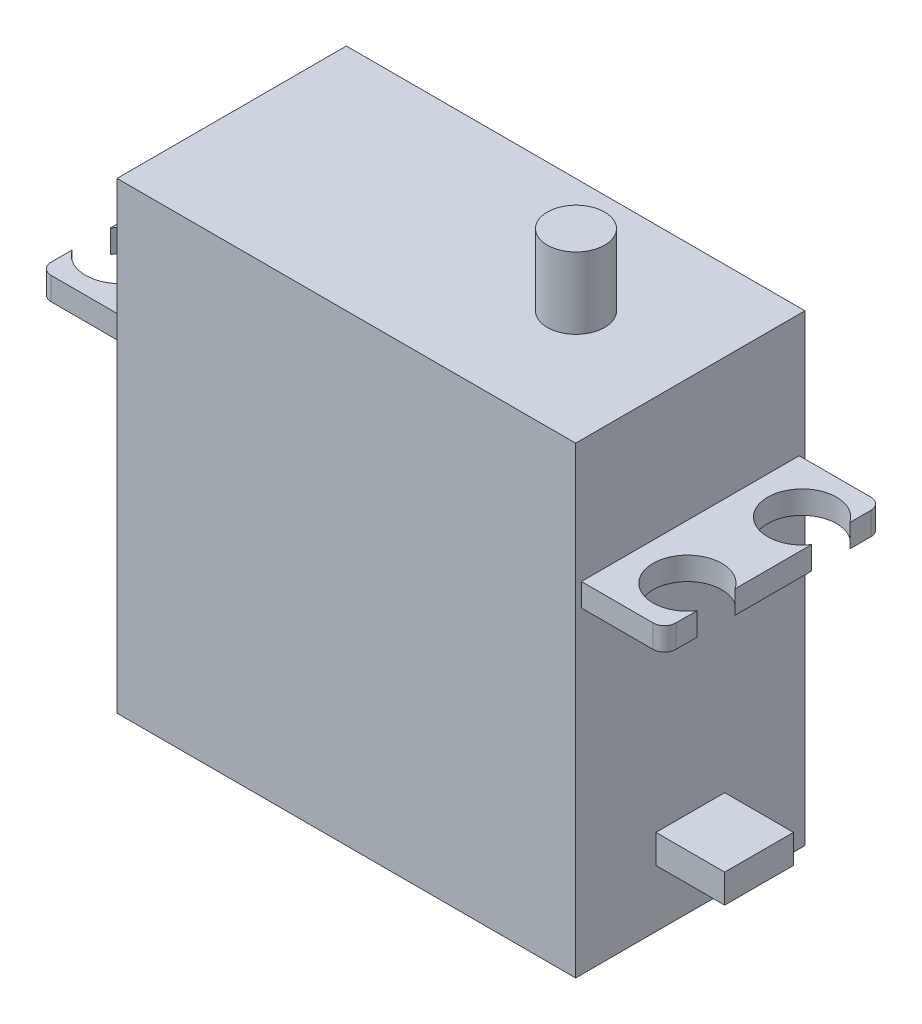
ISO-10303-21;
HEADER;
FILE_DESCRIPTION(('STEP AP214'),'2;1');
FILE_NAME('part.step','',(''),(''),'','','');
FILE_SCHEMA(('AUTOMOTIVE_DESIGN { 1 0 10303 214 1 1 1 1 }'));
ENDSEC;
DATA;
#1=APPLICATION_CONTEXT('core data for automotive mechanical design processes');
#2=APPLICATION_PROTOCOL_DEFINITION('international standard','automotive_design',2000,#1);
#3=PRODUCT_CONTEXT('',#1,'mechanical');
#4=PRODUCT('Part','Part','',(#3));
#5=PRODUCT_RELATED_PRODUCT_CATEGORY('part','',(#4));
#6=PRODUCT_DEFINITION_FORMATION('','',#4);
#7=PRODUCT_DEFINITION_CONTEXT('part definition',#1,'design');
#8=PRODUCT_DEFINITION('design','',#6,#7);
#9=PRODUCT_DEFINITION_SHAPE('','',#8);
#10=(LENGTH_UNIT() NAMED_UNIT(*) SI_UNIT(.MILLI.,.METRE.));
#11=(NAMED_UNIT(*) PLANE_ANGLE_UNIT() SI_UNIT($,.RADIAN.));
#12=(NAMED_UNIT(*) SI_UNIT($,.STERADIAN.) SOLID_ANGLE_UNIT());
#13=UNCERTAINTY_MEASURE_WITH_UNIT(LENGTH_MEASURE(1.E-05),#10,'distance_accuracy_value','');
#14=(GEOMETRIC_REPRESENTATION_CONTEXT(3) GLOBAL_UNCERTAINTY_ASSIGNED_CONTEXT((#13)) GLOBAL_UNIT_ASSIGNED_CONTEXT((#10,
#11,#12)) REPRESENTATION_CONTEXT('',''));
#15=CARTESIAN_POINT('',(0.,0.,0.));
#16=DIRECTION('',(0.,0.,1.));
#17=DIRECTION('',(1.,0.,0.));
#18=AXIS2_PLACEMENT_3D('',#15,#16,#17);
#19=CARTESIAN_POINT('',(40.,0.,20.));
#20=DIRECTION('',(-1.,0.,0.));
#21=DIRECTION('',(0.,0.,1.));
#22=AXIS2_PLACEMENT_3D('',#19,#20,#21);
#23=PLANE('',#22);
#24=DIRECTION('',(0.,1.,0.));
#25=VECTOR('',#24,1.);
#26=CARTESIAN_POINT('',(40.,0.,0.));
#27=LINE('',#26,#25);
#28=CARTESIAN_POINT('',(40.,0.,0.));
#29=VERTEX_POINT('',#28);
#30=CARTESIAN_POINT('',(40.,40.4,0.));
#31=VERTEX_POINT('',#30);
#32=EDGE_CURVE('E329',#29,#31,#27,.T.);
#33=ORIENTED_EDGE('',*,*,#32,.T.);
#34=DIRECTION('',(0.,0.,-1.));
#35=VECTOR('',#34,1.);
#36=CARTESIAN_POINT('',(40.,40.4,20.));
#37=LINE('',#36,#35);
#38=CARTESIAN_POINT('',(40.,40.4,20.));
#39=VERTEX_POINT('',#38);
#40=EDGE_CURVE('E334',#39,#31,#37,.T.);
#41=ORIENTED_EDGE('',*,*,#40,.F.);
#42=DIRECTION('',(0.,1.,0.));
#43=VECTOR('',#42,1.);
#44=CARTESIAN_POINT('',(40.,0.,20.));
#45=LINE('',#44,#43);
#46=CARTESIAN_POINT('',(40.,0.,20.));
#47=VERTEX_POINT('',#46);
#48=EDGE_CURVE('E320',#47,#39,#45,.T.);
#49=ORIENTED_EDGE('',*,*,#48,.F.);
#50=DIRECTION('',(0.,0.,-1.));
#51=VECTOR('',#50,1.);
#52=CARTESIAN_POINT('',(40.,0.,20.));
#53=LINE('',#52,#51);
#54=EDGE_CURVE('E337',#47,#29,#53,.T.);
#55=ORIENTED_EDGE('',*,*,#54,.T.);
#56=EDGE_LOOP('',(#33,#41,#49,#55));
#57=FACE_BOUND('',#56,.T.);
#58=DIRECTION('',(0.,1.,0.));
#59=VECTOR('',#58,1.);
#60=CARTESIAN_POINT('',(40.,0.,19.5));
#61=LINE('',#60,#59);
#62=CARTESIAN_POINT('',(40.,27.7,19.5));
#63=VERTEX_POINT('',#62);
#64=CARTESIAN_POINT('',(40.,29.7,19.5));
#65=VERTEX_POINT('',#64);
#66=EDGE_CURVE('E348',#63,#65,#61,.T.);
#67=ORIENTED_EDGE('',*,*,#66,.T.);
#68=DIRECTION('',(0.,0.,-1.));
#69=VECTOR('',#68,1.);
#70=CARTESIAN_POINT('',(40.,29.7,20.));
#71=LINE('',#70,#69);
#72=CARTESIAN_POINT('',(40.,29.7,0.500000000000007));
#73=VERTEX_POINT('',#72);
#74=EDGE_CURVE('E351',#65,#73,#71,.T.);
#75=ORIENTED_EDGE('',*,*,#74,.T.);
#76=DIRECTION('',(0.,-1.,0.));
#77=VECTOR('',#76,1.);
#78=CARTESIAN_POINT('',(40.,0.,0.500000000000007));
#79=LINE('',#78,#77);
#80=CARTESIAN_POINT('',(40.,27.7,0.500000000000008));
#81=VERTEX_POINT('',#80);
#82=EDGE_CURVE('E346',#73,#81,#79,.T.);
#83=ORIENTED_EDGE('',*,*,#82,.T.);
#84=DIRECTION('',(0.,0.,-1.));
#85=VECTOR('',#84,1.);
#86=CARTESIAN_POINT('',(40.,27.7,20.));
#87=LINE('',#86,#85);
#88=EDGE_CURVE('E343',#63,#81,#87,.T.);
#89=ORIENTED_EDGE('',*,*,#88,.F.);
#90=EDGE_LOOP('',(#67,#75,#83,#89));
#91=FACE_BOUND('',#90,.T.);
#92=DIRECTION('',(0.,-1.,0.));
#93=VECTOR('',#92,1.);
#94=CARTESIAN_POINT('',(40.,7.5,13.));
#95=LINE('',#94,#93);
#96=CARTESIAN_POINT('',(40.,7.5,13.));
#97=VERTEX_POINT('',#96);
#98=CARTESIAN_POINT('',(40.,5.,13.));
#99=VERTEX_POINT('',#98);
#100=EDGE_CURVE('E241',#97,#99,#95,.T.);
#101=ORIENTED_EDGE('',*,*,#100,.F.);
#102=DIRECTION('',(0.,0.,1.));
#103=VECTOR('',#102,1.);
#104=CARTESIAN_POINT('',(40.,7.5,13.));
#105=LINE('',#104,#103);
#106=CARTESIAN_POINT('',(40.,7.5,7.));
#107=VERTEX_POINT('',#106);
#108=EDGE_CURVE('E238',#107,#97,#105,.T.);
#109=ORIENTED_EDGE('',*,*,#108,.F.);
#110=DIRECTION('',(0.,1.,0.));
#111=VECTOR('',#110,1.);
#112=CARTESIAN_POINT('',(40.,7.5,7.));
#113=LINE('',#112,#111);
#114=CARTESIAN_POINT('',(40.,5.,7.));
#115=VERTEX_POINT('',#114);
#116=EDGE_CURVE('E56',#115,#107,#113,.T.);
#117=ORIENTED_EDGE('',*,*,#116,.F.);
#118=DIRECTION('',(0.,0.,-1.));
#119=VECTOR('',#118,1.);
#120=CARTESIAN_POINT('',(40.,5.,13.));
#121=LINE('',#120,#119);
#122=EDGE_CURVE('E51',#99,#115,#121,.T.);
#123=ORIENTED_EDGE('',*,*,#122,.F.);
#124=EDGE_LOOP('',(#101,#109,#117,#123));
#125=FACE_BOUND('',#124,.T.);
#126=ADVANCED_FACE('F36',(#57,#91,#125),#23,.F.);
#127=CARTESIAN_POINT('',(47.25,29.7,0.500000000000009));
#128=DIRECTION('',(1.,0.,0.));
#129=DIRECTION('',(0.,0.,-1.));
#130=AXIS2_PLACEMENT_3D('',#127,#128,#129);
#131=PLANE('',#130);
#132=DIRECTION('',(0.,1.,0.));
#133=VECTOR('',#132,1.);
#134=CARTESIAN_POINT('',(47.25,0.,13.3416876048223));
#135=LINE('',#134,#133);
#136=CARTESIAN_POINT('',(47.25,27.7,13.3416876048223));
#137=VERTEX_POINT('',#136);
#138=CARTESIAN_POINT('',(47.25,29.7,13.3416876048223));
#139=VERTEX_POINT('',#138);
#140=EDGE_CURVE('E273',#137,#139,#135,.T.);
#141=ORIENTED_EDGE('',*,*,#140,.F.);
#142=DIRECTION('',(0.,0.,1.));
#143=VECTOR('',#142,1.);
#144=CARTESIAN_POINT('',(47.25,27.7,0.500000000000009));
#145=LINE('',#144,#143);
#146=CARTESIAN_POINT('',(47.25,27.7,6.65831239517771));
#147=VERTEX_POINT('',#146);
#148=EDGE_CURVE('E301',#147,#137,#145,.T.);
#149=ORIENTED_EDGE('',*,*,#148,.F.);
#150=DIRECTION('',(0.,1.,0.));
#151=VECTOR('',#150,1.);
#152=CARTESIAN_POINT('',(47.25,0.,6.65831239517772));
#153=LINE('',#152,#151);
#154=CARTESIAN_POINT('',(47.25,29.7,6.65831239517771));
#155=VERTEX_POINT('',#154);
#156=EDGE_CURVE('E263',#155,#147,#153,.F.);
#157=ORIENTED_EDGE('',*,*,#156,.F.);
#158=DIRECTION('',(0.,0.,1.));
#159=VECTOR('',#158,1.);
#160=CARTESIAN_POINT('',(47.25,29.7,0.500000000000009));
#161=LINE('',#160,#159);
#162=EDGE_CURVE('E287',#155,#139,#161,.T.);
#163=ORIENTED_EDGE('',*,*,#162,.T.);
#164=EDGE_LOOP('',(#141,#149,#157,#163));
#165=FACE_BOUND('',#164,.T.);
#166=ADVANCED_FACE('F469',(#165),#131,.T.);
#167=CARTESIAN_POINT('',(47.25,27.7,1.50000000000001));
#168=VERTEX_POINT('',#167);
#169=CARTESIAN_POINT('',(47.25,27.7,3.3416876048223));
#170=VERTEX_POINT('',#169);
#171=EDGE_CURVE('E298',#168,#170,#145,.T.);
#172=ORIENTED_EDGE('',*,*,#171,.F.);
#173=DIRECTION('',(0.,-1.,0.));
#174=VECTOR('',#173,1.);
#175=CARTESIAN_POINT('',(47.25,29.7,1.50000000000001));
#176=LINE('',#175,#174);
#177=CARTESIAN_POINT('',(47.25,29.7,1.50000000000001));
#178=VERTEX_POINT('',#177);
#179=EDGE_CURVE('E382',#168,#178,#176,.F.);
#180=ORIENTED_EDGE('',*,*,#179,.T.);
#181=CARTESIAN_POINT('',(47.25,29.7,3.3416876048223));
#182=VERTEX_POINT('',#181);
#183=EDGE_CURVE('E284',#178,#182,#161,.T.);
#184=ORIENTED_EDGE('',*,*,#183,.T.);
#185=DIRECTION('',(0.,1.,0.));
#186=VECTOR('',#185,1.);
#187=CARTESIAN_POINT('',(47.25,0.,3.3416876048223));
#188=LINE('',#187,#186);
#189=EDGE_CURVE('E265',#170,#182,#188,.T.);
#190=ORIENTED_EDGE('',*,*,#189,.F.);
#191=EDGE_LOOP('',(#172,#180,#184,#190));
#192=FACE_BOUND('',#191,.T.);
#193=ADVANCED_FACE('F475',(#192),#131,.T.);
#194=CARTESIAN_POINT('',(-7.25,29.7,0.499999999999998));
#195=DIRECTION('',(-1.,0.,0.));
#196=DIRECTION('',(0.,0.,1.));
#197=AXIS2_PLACEMENT_3D('',#194,#195,#196);
#198=PLANE('',#197);
#199=DIRECTION('',(0.,1.,0.));
#200=VECTOR('',#199,1.);
#201=CARTESIAN_POINT('',(-7.25,0.,6.65831239517768));
#202=LINE('',#201,#200);
#203=CARTESIAN_POINT('',(-7.25,27.7,6.65831239517768));
#204=VERTEX_POINT('',#203);
#205=CARTESIAN_POINT('',(-7.25,29.7,6.65831239517768));
#206=VERTEX_POINT('',#205);
#207=EDGE_CURVE('E360',#204,#206,#202,.T.);
#208=ORIENTED_EDGE('',*,*,#207,.F.);
#209=DIRECTION('',(0.,0.,-1.));
#210=VECTOR('',#209,1.);
#211=CARTESIAN_POINT('',(-7.25,27.7,0.499999999999998));
#212=LINE('',#211,#210);
#213=CARTESIAN_POINT('',(-7.25,27.7,13.3416876048223));
#214=VERTEX_POINT('',#213);
#215=EDGE_CURVE('E294',#214,#204,#212,.T.);
#216=ORIENTED_EDGE('',*,*,#215,.F.);
#217=DIRECTION('',(0.,1.,0.));
#218=VECTOR('',#217,1.);
#219=CARTESIAN_POINT('',(-7.25,0.,13.3416876048223));
#220=LINE('',#219,#218);
#221=CARTESIAN_POINT('',(-7.25,29.7,13.3416876048223));
#222=VERTEX_POINT('',#221);
#223=EDGE_CURVE('E353',#222,#214,#220,.F.);
#224=ORIENTED_EDGE('',*,*,#223,.F.);
#225=DIRECTION('',(0.,0.,-1.));
#226=VECTOR('',#225,1.);
#227=CARTESIAN_POINT('',(-7.25,29.7,0.499999999999998));
#228=LINE('',#227,#226);
#229=EDGE_CURVE('E279',#222,#206,#228,.T.);
#230=ORIENTED_EDGE('',*,*,#229,.T.);
#231=EDGE_LOOP('',(#208,#216,#224,#230));
#232=FACE_BOUND('',#231,.T.);
#233=ADVANCED_FACE('F449',(#232),#198,.T.);
#234=CARTESIAN_POINT('',(-7.25,27.7,18.5));
#235=VERTEX_POINT('',#234);
#236=CARTESIAN_POINT('',(-7.25,27.7,16.6583123951777));
#237=VERTEX_POINT('',#236);
#238=EDGE_CURVE('E291',#235,#237,#212,.T.);
#239=ORIENTED_EDGE('',*,*,#238,.F.);
#240=DIRECTION('',(0.,-1.,0.));
#241=VECTOR('',#240,1.);
#242=CARTESIAN_POINT('',(-7.25,29.7,18.5));
#243=LINE('',#242,#241);
#244=CARTESIAN_POINT('',(-7.25,29.7,18.5));
#245=VERTEX_POINT('',#244);
#246=EDGE_CURVE('E44',#235,#245,#243,.F.);
#247=ORIENTED_EDGE('',*,*,#246,.T.);
#248=CARTESIAN_POINT('',(-7.25,29.7,16.6583123951777));
#249=VERTEX_POINT('',#248);
#250=EDGE_CURVE('E276',#245,#249,#228,.T.);
#251=ORIENTED_EDGE('',*,*,#250,.T.);
#252=DIRECTION('',(0.,1.,0.));
#253=VECTOR('',#252,1.);
#254=CARTESIAN_POINT('',(-7.25,0.,16.6583123951777));
#255=LINE('',#254,#253);
#256=EDGE_CURVE('E355',#237,#249,#255,.T.);
#257=ORIENTED_EDGE('',*,*,#256,.F.);
#258=EDGE_LOOP('',(#239,#247,#251,#257));
#259=FACE_BOUND('',#258,.T.);
#260=ADVANCED_FACE('F403',(#259),#198,.T.);
#261=CARTESIAN_POINT('',(0.,0.,20.));
#262=DIRECTION('',(1.,0.,0.));
#263=DIRECTION('',(0.,0.,-1.));
#264=AXIS2_PLACEMENT_3D('',#261,#262,#263);
#265=PLANE('',#264);
#266=DIRECTION('',(0.,1.,0.));
#267=VECTOR('',#266,1.);
#268=CARTESIAN_POINT('',(0.,0.,0.499999999999997));
#269=LINE('',#268,#267);
#270=CARTESIAN_POINT('',(0.,27.7,0.5));
#271=VERTEX_POINT('',#270);
#272=CARTESIAN_POINT('',(0.,29.7,0.499999999999997));
#273=VERTEX_POINT('',#272);
#274=EDGE_CURVE('E308',#271,#273,#269,.T.);
#275=ORIENTED_EDGE('',*,*,#274,.T.);
#276=DIRECTION('',(0.,0.,1.));
#277=VECTOR('',#276,1.);
#278=CARTESIAN_POINT('',(0.,29.7,20.));
#279=LINE('',#278,#277);
#280=CARTESIAN_POINT('',(0.,29.7,19.5));
#281=VERTEX_POINT('',#280);
#282=EDGE_CURVE('E306',#273,#281,#279,.T.);
#283=ORIENTED_EDGE('',*,*,#282,.T.);
#284=DIRECTION('',(0.,-1.,0.));
#285=VECTOR('',#284,1.);
#286=CARTESIAN_POINT('',(0.,0.,19.5));
#287=LINE('',#286,#285);
#288=CARTESIAN_POINT('',(0.,27.7,19.5));
#289=VERTEX_POINT('',#288);
#290=EDGE_CURVE('E311',#281,#289,#287,.T.);
#291=ORIENTED_EDGE('',*,*,#290,.T.);
#292=DIRECTION('',(0.,0.,1.));
#293=VECTOR('',#292,1.);
#294=CARTESIAN_POINT('',(0.,27.7,20.));
#295=LINE('',#294,#293);
#296=EDGE_CURVE('E290',#271,#289,#295,.T.);
#297=ORIENTED_EDGE('',*,*,#296,.F.);
#298=EDGE_LOOP('',(#275,#283,#291,#297));
#299=FACE_BOUND('',#298,.T.);
#300=DIRECTION('',(0.,-1.,0.));
#301=VECTOR('',#300,1.);
#302=CARTESIAN_POINT('',(0.,0.,0.));
#303=LINE('',#302,#301);
#304=CARTESIAN_POINT('',(0.,40.4,0.));
#305=VERTEX_POINT('',#304);
#306=CARTESIAN_POINT('',(0.,0.,0.));
#307=VERTEX_POINT('',#306);
#308=EDGE_CURVE('E313',#305,#307,#303,.T.);
#309=ORIENTED_EDGE('',*,*,#308,.T.);
#310=DIRECTION('',(0.,0.,-1.));
#311=VECTOR('',#310,1.);
#312=CARTESIAN_POINT('',(0.,0.,20.));
#313=LINE('',#312,#311);
#314=CARTESIAN_POINT('',(0.,0.,20.));
#315=VERTEX_POINT('',#314);
#316=EDGE_CURVE('E340',#315,#307,#313,.T.);
#317=ORIENTED_EDGE('',*,*,#316,.F.);
#318=DIRECTION('',(0.,-1.,0.));
#319=VECTOR('',#318,1.);
#320=CARTESIAN_POINT('',(0.,0.,20.));
#321=LINE('',#320,#319);
#322=CARTESIAN_POINT('',(0.,40.4,20.));
#323=VERTEX_POINT('',#322);
#324=EDGE_CURVE('E314',#323,#315,#321,.T.);
#325=ORIENTED_EDGE('',*,*,#324,.F.);
#326=DIRECTION('',(0.,0.,-1.));
#327=VECTOR('',#326,1.);
#328=CARTESIAN_POINT('',(0.,40.4,20.));
#329=LINE('',#328,#327);
#330=EDGE_CURVE('E324',#323,#305,#329,.T.);
#331=ORIENTED_EDGE('',*,*,#330,.T.);
#332=EDGE_LOOP('',(#309,#317,#325,#331));
#333=FACE_BOUND('',#332,.T.);
#334=ADVANCED_FACE('F427',(#299,#333),#265,.F.);
#335=CARTESIAN_POINT('',(0.,0.,20.));
#336=DIRECTION('',(0.,1.,0.));
#337=DIRECTION('',(0.,0.,1.));
#338=AXIS2_PLACEMENT_3D('',#335,#336,#337);
#339=PLANE('',#338);
#340=DIRECTION('',(1.,0.,0.));
#341=VECTOR('',#340,1.);
#342=CARTESIAN_POINT('',(0.,0.,0.));
#343=LINE('',#342,#341);
#344=EDGE_CURVE('E327',#307,#29,#343,.T.);
#345=ORIENTED_EDGE('',*,*,#344,.T.);
#346=ORIENTED_EDGE('',*,*,#54,.F.);
#347=DIRECTION('',(1.,0.,0.));
#348=VECTOR('',#347,1.);
#349=CARTESIAN_POINT('',(0.,0.,20.));
#350=LINE('',#349,#348);
#351=EDGE_CURVE('E317',#315,#47,#350,.T.);
#352=ORIENTED_EDGE('',*,*,#351,.F.);
#353=ORIENTED_EDGE('',*,*,#316,.T.);
#354=EDGE_LOOP('',(#345,#346,#352,#353));
#355=FACE_BOUND('',#354,.T.);
#356=ADVANCED_FACE('F484',(#355),#339,.F.);
#357=CARTESIAN_POINT('',(0.,40.4,20.));
#358=DIRECTION('',(0.,-1.,0.));
#359=DIRECTION('',(0.,0.,-1.));
#360=AXIS2_PLACEMENT_3D('',#357,#358,#359);
#361=PLANE('',#360);
#362=CARTESIAN_POINT('',(30.03,40.4,10.));
#363=DIRECTION('',(0.,-1.,0.));
#364=DIRECTION('',(0.,0.,-1.));
#365=AXIS2_PLACEMENT_3D('',#362,#363,#364);
#366=CIRCLE('',#365,2.5);
#367=CARTESIAN_POINT('',(30.03,40.4,7.5));
#368=VERTEX_POINT('',#367);
#369=EDGE_CURVE('E11',#368,#368,#366,.F.);
#370=ORIENTED_EDGE('',*,*,#369,.F.);
#371=EDGE_LOOP('',(#370));
#372=FACE_BOUND('',#371,.T.);
#373=DIRECTION('',(-1.,0.,0.));
#374=VECTOR('',#373,1.);
#375=CARTESIAN_POINT('',(0.,40.4,0.));
#376=LINE('',#375,#374);
#377=EDGE_CURVE('E318',#31,#305,#376,.T.);
#378=ORIENTED_EDGE('',*,*,#377,.T.);
#379=ORIENTED_EDGE('',*,*,#330,.F.);
#380=DIRECTION('',(-1.,0.,0.));
#381=VECTOR('',#380,1.);
#382=CARTESIAN_POINT('',(0.,40.4,20.));
#383=LINE('',#382,#381);
#384=EDGE_CURVE('E322',#39,#323,#383,.T.);
#385=ORIENTED_EDGE('',*,*,#384,.F.);
#386=ORIENTED_EDGE('',*,*,#40,.T.);
#387=EDGE_LOOP('',(#378,#379,#385,#386));
#388=FACE_BOUND('',#387,.T.);
#389=ADVANCED_FACE('F482',(#372,#388),#361,.F.);
#390=CARTESIAN_POINT('',(0.,0.,20.));
#391=DIRECTION('',(0.,0.,-1.));
#392=DIRECTION('',(-1.,0.,0.));
#393=AXIS2_PLACEMENT_3D('',#390,#391,#392);
#394=PLANE('',#393);
#395=ORIENTED_EDGE('',*,*,#324,.T.);
#396=ORIENTED_EDGE('',*,*,#351,.T.);
#397=ORIENTED_EDGE('',*,*,#48,.T.);
#398=ORIENTED_EDGE('',*,*,#384,.T.);
#399=EDGE_LOOP('',(#395,#396,#397,#398));
#400=FACE_BOUND('',#399,.T.);
#401=ADVANCED_FACE('F565',(#400),#394,.F.);
#402=CARTESIAN_POINT('',(0.,0.,0.));
#403=DIRECTION('',(0.,0.,-1.));
#404=DIRECTION('',(-1.,0.,0.));
#405=AXIS2_PLACEMENT_3D('',#402,#403,#404);
#406=PLANE('',#405);
#407=ORIENTED_EDGE('',*,*,#308,.F.);
#408=ORIENTED_EDGE('',*,*,#377,.F.);
#409=ORIENTED_EDGE('',*,*,#32,.F.);
#410=ORIENTED_EDGE('',*,*,#344,.F.);
#411=EDGE_LOOP('',(#407,#408,#409,#410));
#412=FACE_BOUND('',#411,.T.);
#413=ADVANCED_FACE('F676',(#412),#406,.T.);
#414=CARTESIAN_POINT('',(47.25,29.7,16.6583123951777));
#415=VERTEX_POINT('',#414);
#416=CARTESIAN_POINT('',(47.25,29.7,18.5));
#417=VERTEX_POINT('',#416);
#418=EDGE_CURVE('E283',#415,#417,#161,.T.);
#419=ORIENTED_EDGE('',*,*,#418,.T.);
#420=DIRECTION('',(0.,-1.,0.));
#421=VECTOR('',#420,1.);
#422=CARTESIAN_POINT('',(47.25,29.7,18.5));
#423=LINE('',#422,#421);
#424=CARTESIAN_POINT('',(47.25,27.7,18.5));
#425=VERTEX_POINT('',#424);
#426=EDGE_CURVE('E366',#417,#425,#423,.T.);
#427=ORIENTED_EDGE('',*,*,#426,.T.);
#428=CARTESIAN_POINT('',(47.25,27.7,16.6583123951777));
#429=VERTEX_POINT('',#428);
#430=EDGE_CURVE('E297',#429,#425,#145,.T.);
#431=ORIENTED_EDGE('',*,*,#430,.F.);
#432=DIRECTION('',(0.,1.,0.));
#433=VECTOR('',#432,1.);
#434=CARTESIAN_POINT('',(47.25,0.,16.6583123951777));
#435=LINE('',#434,#433);
#436=EDGE_CURVE('E271',#415,#429,#435,.F.);
#437=ORIENTED_EDGE('',*,*,#436,.F.);
#438=EDGE_LOOP('',(#419,#427,#431,#437));
#439=FACE_BOUND('',#438,.T.);
#440=ADVANCED_FACE('F478',(#439),#131,.T.);
#441=CARTESIAN_POINT('',(0.,27.7,0.));
#442=DIRECTION('',(0.,1.,0.));
#443=DIRECTION('',(0.,0.,1.));
#444=AXIS2_PLACEMENT_3D('',#441,#442,#443);
#445=PLANE('',#444);
#446=ORIENTED_EDGE('',*,*,#430,.T.);
#447=CARTESIAN_POINT('',(46.25,27.7,18.5));
#448=DIRECTION('',(0.,1.,0.));
#449=DIRECTION('',(0.,0.,1.));
#450=AXIS2_PLACEMENT_3D('',#447,#448,#449);
#451=CIRCLE('',#450,1.);
#452=CARTESIAN_POINT('',(46.25,27.7,19.5));
#453=VERTEX_POINT('',#452);
#454=EDGE_CURVE('E371',#425,#453,#451,.F.);
#455=ORIENTED_EDGE('',*,*,#454,.T.);
#456=DIRECTION('',(-1.,0.,0.));
#457=VECTOR('',#456,1.);
#458=CARTESIAN_POINT('',(-7.25,27.7,19.5));
#459=LINE('',#458,#457);
#460=EDGE_CURVE('E302',#453,#63,#459,.T.);
#461=ORIENTED_EDGE('',*,*,#460,.T.);
#462=ORIENTED_EDGE('',*,*,#88,.T.);
#463=DIRECTION('',(1.,0.,0.));
#464=VECTOR('',#463,1.);
#465=CARTESIAN_POINT('',(-7.25,27.7,0.499999999999998));
#466=LINE('',#465,#464);
#467=CARTESIAN_POINT('',(46.25,27.7,0.500000000000009));
#468=VERTEX_POINT('',#467);
#469=EDGE_CURVE('E293',#81,#468,#466,.T.);
#470=ORIENTED_EDGE('',*,*,#469,.T.);
#471=CARTESIAN_POINT('',(46.25,27.7,1.50000000000001));
#472=DIRECTION('',(0.,1.,0.));
#473=DIRECTION('',(0.,0.,1.));
#474=AXIS2_PLACEMENT_3D('',#471,#472,#473);
#475=CIRCLE('',#474,1.);
#476=EDGE_CURVE('E369',#468,#168,#475,.F.);
#477=ORIENTED_EDGE('',*,*,#476,.T.);
#478=ORIENTED_EDGE('',*,*,#171,.T.);
#479=CARTESIAN_POINT('',(44.75,27.7,5.));
#480=DIRECTION('',(0.,1.,0.));
#481=DIRECTION('',(0.,0.,1.));
#482=AXIS2_PLACEMENT_3D('',#479,#480,#481);
#483=CIRCLE('',#482,3.);
#484=EDGE_CURVE('E260',#170,#147,#483,.T.);
#485=ORIENTED_EDGE('',*,*,#484,.T.);
#486=ORIENTED_EDGE('',*,*,#148,.T.);
#487=CARTESIAN_POINT('',(44.75,27.7,15.));
#488=DIRECTION('',(0.,1.,0.));
#489=DIRECTION('',(0.,0.,1.));
#490=AXIS2_PLACEMENT_3D('',#487,#488,#489);
#491=CIRCLE('',#490,3.);
#492=EDGE_CURVE('E268',#137,#429,#491,.T.);
#493=ORIENTED_EDGE('',*,*,#492,.T.);
#494=EDGE_LOOP('',(#446,#455,#461,#462,#470,#477,#478,#485,#486,#493));
#495=FACE_BOUND('',#494,.T.);
#496=ADVANCED_FACE('F609',(#495),#445,.F.);
#497=CARTESIAN_POINT('',(0.,29.7,0.));
#498=DIRECTION('',(0.,1.,0.));
#499=DIRECTION('',(0.,0.,1.));
#500=AXIS2_PLACEMENT_3D('',#497,#498,#499);
#501=PLANE('',#500);
#502=DIRECTION('',(-1.,0.,0.));
#503=VECTOR('',#502,1.);
#504=CARTESIAN_POINT('',(-7.25,29.7,19.5));
#505=LINE('',#504,#503);
#506=CARTESIAN_POINT('',(46.25,29.7,19.5));
#507=VERTEX_POINT('',#506);
#508=EDGE_CURVE('E288',#507,#65,#505,.T.);
#509=ORIENTED_EDGE('',*,*,#508,.F.);
#510=CARTESIAN_POINT('',(46.25,29.7,18.5));
#511=DIRECTION('',(0.,1.,0.));
#512=DIRECTION('',(0.,0.,1.));
#513=AXIS2_PLACEMENT_3D('',#510,#511,#512);
#514=CIRCLE('',#513,1.);
#515=EDGE_CURVE('E377',#507,#417,#514,.T.);
#516=ORIENTED_EDGE('',*,*,#515,.T.);
#517=ORIENTED_EDGE('',*,*,#418,.F.);
#518=CARTESIAN_POINT('',(44.75,29.7,15.));
#519=DIRECTION('',(0.,1.,0.));
#520=DIRECTION('',(0.,0.,1.));
#521=AXIS2_PLACEMENT_3D('',#518,#519,#520);
#522=CIRCLE('',#521,3.);
#523=EDGE_CURVE('E364',#139,#415,#522,.T.);
#524=ORIENTED_EDGE('',*,*,#523,.F.);
#525=ORIENTED_EDGE('',*,*,#162,.F.);
#526=CARTESIAN_POINT('',(44.75,29.7,5.));
#527=DIRECTION('',(0.,1.,0.));
#528=DIRECTION('',(0.,0.,1.));
#529=AXIS2_PLACEMENT_3D('',#526,#527,#528);
#530=CIRCLE('',#529,3.);
#531=EDGE_CURVE('E362',#182,#155,#530,.T.);
#532=ORIENTED_EDGE('',*,*,#531,.F.);
#533=ORIENTED_EDGE('',*,*,#183,.F.);
#534=CARTESIAN_POINT('',(46.25,29.7,1.50000000000001));
#535=DIRECTION('',(0.,1.,0.));
#536=DIRECTION('',(0.,0.,1.));
#537=AXIS2_PLACEMENT_3D('',#534,#535,#536);
#538=CIRCLE('',#537,1.);
#539=CARTESIAN_POINT('',(46.25,29.7,0.500000000000009));
#540=VERTEX_POINT('',#539);
#541=EDGE_CURVE('E375',#178,#540,#538,.T.);
#542=ORIENTED_EDGE('',*,*,#541,.T.);
#543=DIRECTION('',(1.,0.,0.));
#544=VECTOR('',#543,1.);
#545=CARTESIAN_POINT('',(-7.25,29.7,0.499999999999998));
#546=LINE('',#545,#544);
#547=EDGE_CURVE('E278',#73,#540,#546,.T.);
#548=ORIENTED_EDGE('',*,*,#547,.F.);
#549=ORIENTED_EDGE('',*,*,#74,.F.);
#550=EDGE_LOOP('',(#509,#516,#517,#524,#525,#532,#533,#542,#548,#549));
#551=FACE_BOUND('',#550,.T.);
#552=ADVANCED_FACE('F618',(#551),#501,.T.);
#553=CARTESIAN_POINT('',(-7.25,29.7,0.499999999999998));
#554=DIRECTION('',(0.,0.,-1.));
#555=DIRECTION('',(-1.,0.,0.));
#556=AXIS2_PLACEMENT_3D('',#553,#554,#555);
#557=PLANE('',#556);
#558=ORIENTED_EDGE('',*,*,#547,.T.);
#559=DIRECTION('',(0.,-1.,0.));
#560=VECTOR('',#559,1.);
#561=CARTESIAN_POINT('',(46.25,29.7,0.500000000000009));
#562=LINE('',#561,#560);
#563=EDGE_CURVE('E379',#540,#468,#562,.T.);
#564=ORIENTED_EDGE('',*,*,#563,.T.);
#565=ORIENTED_EDGE('',*,*,#469,.F.);
#566=ORIENTED_EDGE('',*,*,#82,.F.);
#567=EDGE_LOOP('',(#558,#564,#565,#566));
#568=FACE_BOUND('',#567,.T.);
#569=ADVANCED_FACE('F627',(#568),#557,.T.);
#570=CARTESIAN_POINT('',(-7.25,29.7,19.5));
#571=DIRECTION('',(0.,0.,1.));
#572=DIRECTION('',(1.,0.,0.));
#573=AXIS2_PLACEMENT_3D('',#570,#571,#572);
#574=PLANE('',#573);
#575=ORIENTED_EDGE('',*,*,#460,.F.);
#576=DIRECTION('',(0.,-1.,0.));
#577=VECTOR('',#576,1.);
#578=CARTESIAN_POINT('',(46.25,29.7,19.5));
#579=LINE('',#578,#577);
#580=EDGE_CURVE('E373',#453,#507,#579,.F.);
#581=ORIENTED_EDGE('',*,*,#580,.T.);
#582=ORIENTED_EDGE('',*,*,#508,.T.);
#583=ORIENTED_EDGE('',*,*,#66,.F.);
#584=EDGE_LOOP('',(#575,#581,#582,#583));
#585=FACE_BOUND('',#584,.T.);
#586=ADVANCED_FACE('F635',(#585),#574,.T.);
#587=CARTESIAN_POINT('',(-6.25,29.7,19.5));
#588=VERTEX_POINT('',#587);
#589=EDGE_CURVE('E286',#281,#588,#505,.T.);
#590=ORIENTED_EDGE('',*,*,#589,.T.);
#591=DIRECTION('',(0.,-1.,0.));
#592=VECTOR('',#591,1.);
#593=CARTESIAN_POINT('',(-6.25,29.7,19.5));
#594=LINE('',#593,#592);
#595=CARTESIAN_POINT('',(-6.25,27.7,19.5));
#596=VERTEX_POINT('',#595);
#597=EDGE_CURVE('E397',#588,#596,#594,.T.);
#598=ORIENTED_EDGE('',*,*,#597,.T.);
#599=EDGE_CURVE('E300',#289,#596,#459,.T.);
#600=ORIENTED_EDGE('',*,*,#599,.F.);
#601=ORIENTED_EDGE('',*,*,#290,.F.);
#602=EDGE_LOOP('',(#590,#598,#600,#601));
#603=FACE_BOUND('',#602,.T.);
#604=ADVANCED_FACE('F418',(#603),#574,.T.);
#605=CARTESIAN_POINT('',(-6.25,27.7,0.499999999999999));
#606=VERTEX_POINT('',#605);
#607=EDGE_CURVE('E295',#606,#271,#466,.T.);
#608=ORIENTED_EDGE('',*,*,#607,.F.);
#609=DIRECTION('',(0.,-1.,0.));
#610=VECTOR('',#609,1.);
#611=CARTESIAN_POINT('',(-6.25,29.7,0.499999999999999));
#612=LINE('',#611,#610);
#613=CARTESIAN_POINT('',(-6.25,29.7,0.499999999999999));
#614=VERTEX_POINT('',#613);
#615=EDGE_CURVE('E391',#606,#614,#612,.F.);
#616=ORIENTED_EDGE('',*,*,#615,.T.);
#617=EDGE_CURVE('E281',#614,#273,#546,.T.);
#618=ORIENTED_EDGE('',*,*,#617,.T.);
#619=ORIENTED_EDGE('',*,*,#274,.F.);
#620=EDGE_LOOP('',(#608,#616,#618,#619));
#621=FACE_BOUND('',#620,.T.);
#622=ADVANCED_FACE('F431',(#621),#557,.T.);
#623=ORIENTED_EDGE('',*,*,#617,.F.);
#624=CARTESIAN_POINT('',(-6.25,29.7,1.5));
#625=DIRECTION('',(0.,1.,0.));
#626=DIRECTION('',(0.,0.,1.));
#627=AXIS2_PLACEMENT_3D('',#624,#625,#626);
#628=CIRCLE('',#627,1.);
#629=CARTESIAN_POINT('',(-7.25,29.7,1.5));
#630=VERTEX_POINT('',#629);
#631=EDGE_CURVE('E395',#614,#630,#628,.T.);
#632=ORIENTED_EDGE('',*,*,#631,.T.);
#633=CARTESIAN_POINT('',(-7.25,29.7,3.3416876048223));
#634=VERTEX_POINT('',#633);
#635=EDGE_CURVE('E280',#634,#630,#228,.T.);
#636=ORIENTED_EDGE('',*,*,#635,.F.);
#637=CARTESIAN_POINT('',(-4.74999999999999,29.7,4.99999999999999));
#638=DIRECTION('',(0.,1.,0.));
#639=DIRECTION('',(0.,0.,1.));
#640=AXIS2_PLACEMENT_3D('',#637,#638,#639);
#641=CIRCLE('',#640,3.);
#642=EDGE_CURVE('E245',#206,#634,#641,.T.);
#643=ORIENTED_EDGE('',*,*,#642,.F.);
#644=ORIENTED_EDGE('',*,*,#229,.F.);
#645=CARTESIAN_POINT('',(-4.74999999999999,29.7,15.));
#646=DIRECTION('',(0.,1.,0.));
#647=DIRECTION('',(0.,0.,1.));
#648=AXIS2_PLACEMENT_3D('',#645,#646,#647);
#649=CIRCLE('',#648,3.);
#650=EDGE_CURVE('E252',#249,#222,#649,.T.);
#651=ORIENTED_EDGE('',*,*,#650,.F.);
#652=ORIENTED_EDGE('',*,*,#250,.F.);
#653=CARTESIAN_POINT('',(-6.25,29.7,18.5));
#654=DIRECTION('',(0.,1.,0.));
#655=DIRECTION('',(0.,0.,1.));
#656=AXIS2_PLACEMENT_3D('',#653,#654,#655);
#657=CIRCLE('',#656,1.);
#658=EDGE_CURVE('E393',#245,#588,#657,.T.);
#659=ORIENTED_EDGE('',*,*,#658,.T.);
#660=ORIENTED_EDGE('',*,*,#589,.F.);
#661=ORIENTED_EDGE('',*,*,#282,.F.);
#662=EDGE_LOOP('',(#623,#632,#636,#643,#644,#651,#652,#659,#660,#661));
#663=FACE_BOUND('',#662,.T.);
#664=ADVANCED_FACE('F410',(#663),#501,.T.);
#665=CARTESIAN_POINT('',(-7.25,27.7,3.3416876048223));
#666=VERTEX_POINT('',#665);
#667=CARTESIAN_POINT('',(-7.25,27.7,1.5));
#668=VERTEX_POINT('',#667);
#669=EDGE_CURVE('E275',#666,#668,#212,.T.);
#670=ORIENTED_EDGE('',*,*,#669,.T.);
#671=CARTESIAN_POINT('',(-6.25,27.7,1.5));
#672=DIRECTION('',(0.,1.,0.));
#673=DIRECTION('',(0.,0.,1.));
#674=AXIS2_PLACEMENT_3D('',#671,#672,#673);
#675=CIRCLE('',#674,1.);
#676=EDGE_CURVE('E389',#668,#606,#675,.F.);
#677=ORIENTED_EDGE('',*,*,#676,.T.);
#678=ORIENTED_EDGE('',*,*,#607,.T.);
#679=ORIENTED_EDGE('',*,*,#296,.T.);
#680=ORIENTED_EDGE('',*,*,#599,.T.);
#681=CARTESIAN_POINT('',(-6.25,27.7,18.5));
#682=DIRECTION('',(0.,1.,0.));
#683=DIRECTION('',(0.,0.,1.));
#684=AXIS2_PLACEMENT_3D('',#681,#682,#683);
#685=CIRCLE('',#684,1.);
#686=EDGE_CURVE('E387',#596,#235,#685,.F.);
#687=ORIENTED_EDGE('',*,*,#686,.T.);
#688=ORIENTED_EDGE('',*,*,#238,.T.);
#689=CARTESIAN_POINT('',(-4.74999999999999,27.7,15.));
#690=DIRECTION('',(0.,1.,0.));
#691=DIRECTION('',(0.,0.,1.));
#692=AXIS2_PLACEMENT_3D('',#689,#690,#691);
#693=CIRCLE('',#692,3.);
#694=EDGE_CURVE('E254',#237,#214,#693,.T.);
#695=ORIENTED_EDGE('',*,*,#694,.T.);
#696=ORIENTED_EDGE('',*,*,#215,.T.);
#697=CARTESIAN_POINT('',(-4.74999999999999,27.7,4.99999999999999));
#698=DIRECTION('',(0.,1.,0.));
#699=DIRECTION('',(0.,0.,1.));
#700=AXIS2_PLACEMENT_3D('',#697,#698,#699);
#701=CIRCLE('',#700,3.);
#702=EDGE_CURVE('E257',#204,#666,#701,.T.);
#703=ORIENTED_EDGE('',*,*,#702,.T.);
#704=EDGE_LOOP('',(#670,#677,#678,#679,#680,#687,#688,#695,#696,#703));
#705=FACE_BOUND('',#704,.T.);
#706=ADVANCED_FACE('F422',(#705),#445,.F.);
#707=ORIENTED_EDGE('',*,*,#635,.T.);
#708=DIRECTION('',(0.,-1.,0.));
#709=VECTOR('',#708,1.);
#710=CARTESIAN_POINT('',(-7.25,29.7,1.5));
#711=LINE('',#710,#709);
#712=EDGE_CURVE('E384',#630,#668,#711,.T.);
#713=ORIENTED_EDGE('',*,*,#712,.T.);
#714=ORIENTED_EDGE('',*,*,#669,.F.);
#715=DIRECTION('',(0.,1.,0.));
#716=VECTOR('',#715,1.);
#717=CARTESIAN_POINT('',(-7.25,0.,3.3416876048223));
#718=LINE('',#717,#716);
#719=EDGE_CURVE('E358',#634,#666,#718,.F.);
#720=ORIENTED_EDGE('',*,*,#719,.F.);
#721=EDGE_LOOP('',(#707,#713,#714,#720));
#722=FACE_BOUND('',#721,.T.);
#723=ADVANCED_FACE('F441',(#722),#198,.T.);
#724=CARTESIAN_POINT('',(-4.74999999999999,0.,15.));
#725=DIRECTION('',(0.,1.,0.));
#726=DIRECTION('',(0.,0.,1.));
#727=AXIS2_PLACEMENT_3D('',#724,#725,#726);
#728=CYLINDRICAL_SURFACE('',#727,3.);
#729=ORIENTED_EDGE('',*,*,#256,.T.);
#730=ORIENTED_EDGE('',*,*,#650,.T.);
#731=ORIENTED_EDGE('',*,*,#223,.T.);
#732=ORIENTED_EDGE('',*,*,#694,.F.);
#733=EDGE_LOOP('',(#729,#730,#731,#732));
#734=FACE_BOUND('',#733,.T.);
#735=ADVANCED_FACE('F456',(#734),#728,.F.);
#736=CARTESIAN_POINT('',(-4.74999999999999,0.,4.99999999999999));
#737=DIRECTION('',(0.,1.,0.));
#738=DIRECTION('',(0.,0.,1.));
#739=AXIS2_PLACEMENT_3D('',#736,#737,#738);
#740=CYLINDRICAL_SURFACE('',#739,3.);
#741=ORIENTED_EDGE('',*,*,#207,.T.);
#742=ORIENTED_EDGE('',*,*,#642,.T.);
#743=ORIENTED_EDGE('',*,*,#719,.T.);
#744=ORIENTED_EDGE('',*,*,#702,.F.);
#745=EDGE_LOOP('',(#741,#742,#743,#744));
#746=FACE_BOUND('',#745,.T.);
#747=ADVANCED_FACE('F453',(#746),#740,.F.);
#748=CARTESIAN_POINT('',(44.75,0.,5.));
#749=DIRECTION('',(0.,1.,0.));
#750=DIRECTION('',(0.,0.,1.));
#751=AXIS2_PLACEMENT_3D('',#748,#749,#750);
#752=CYLINDRICAL_SURFACE('',#751,3.);
#753=ORIENTED_EDGE('',*,*,#189,.T.);
#754=ORIENTED_EDGE('',*,*,#531,.T.);
#755=ORIENTED_EDGE('',*,*,#156,.T.);
#756=ORIENTED_EDGE('',*,*,#484,.F.);
#757=EDGE_LOOP('',(#753,#754,#755,#756));
#758=FACE_BOUND('',#757,.T.);
#759=ADVANCED_FACE('F455',(#758),#752,.F.);
#760=CARTESIAN_POINT('',(44.75,0.,15.));
#761=DIRECTION('',(0.,1.,0.));
#762=DIRECTION('',(0.,0.,1.));
#763=AXIS2_PLACEMENT_3D('',#760,#761,#762);
#764=CYLINDRICAL_SURFACE('',#763,3.);
#765=ORIENTED_EDGE('',*,*,#140,.T.);
#766=ORIENTED_EDGE('',*,*,#523,.T.);
#767=ORIENTED_EDGE('',*,*,#436,.T.);
#768=ORIENTED_EDGE('',*,*,#492,.F.);
#769=EDGE_LOOP('',(#765,#766,#767,#768));
#770=FACE_BOUND('',#769,.T.);
#771=ADVANCED_FACE('F462',(#770),#764,.F.);
#772=CARTESIAN_POINT('',(46.25,29.7,18.5));
#773=DIRECTION('',(0.,-1.,0.));
#774=DIRECTION('',(0.,0.,-1.));
#775=AXIS2_PLACEMENT_3D('',#772,#773,#774);
#776=CYLINDRICAL_SURFACE('',#775,1.);
#777=ORIENTED_EDGE('',*,*,#515,.F.);
#778=ORIENTED_EDGE('',*,*,#580,.F.);
#779=ORIENTED_EDGE('',*,*,#454,.F.);
#780=ORIENTED_EDGE('',*,*,#426,.F.);
#781=EDGE_LOOP('',(#777,#778,#779,#780));
#782=FACE_BOUND('',#781,.T.);
#783=ADVANCED_FACE('F490',(#782),#776,.T.);
#784=CARTESIAN_POINT('',(46.25,29.7,1.50000000000001));
#785=DIRECTION('',(0.,-1.,0.));
#786=DIRECTION('',(0.,0.,-1.));
#787=AXIS2_PLACEMENT_3D('',#784,#785,#786);
#788=CYLINDRICAL_SURFACE('',#787,1.);
#789=ORIENTED_EDGE('',*,*,#541,.F.);
#790=ORIENTED_EDGE('',*,*,#179,.F.);
#791=ORIENTED_EDGE('',*,*,#476,.F.);
#792=ORIENTED_EDGE('',*,*,#563,.F.);
#793=EDGE_LOOP('',(#789,#790,#791,#792));
#794=FACE_BOUND('',#793,.T.);
#795=ADVANCED_FACE('F493',(#794),#788,.T.);
#796=CARTESIAN_POINT('',(-6.25,29.7,1.5));
#797=DIRECTION('',(0.,-1.,0.));
#798=DIRECTION('',(0.,0.,-1.));
#799=AXIS2_PLACEMENT_3D('',#796,#797,#798);
#800=CYLINDRICAL_SURFACE('',#799,1.);
#801=ORIENTED_EDGE('',*,*,#631,.F.);
#802=ORIENTED_EDGE('',*,*,#615,.F.);
#803=ORIENTED_EDGE('',*,*,#676,.F.);
#804=ORIENTED_EDGE('',*,*,#712,.F.);
#805=EDGE_LOOP('',(#801,#802,#803,#804));
#806=FACE_BOUND('',#805,.T.);
#807=ADVANCED_FACE('F438',(#806),#800,.T.);
#808=CARTESIAN_POINT('',(-6.25,29.7,18.5));
#809=DIRECTION('',(0.,-1.,0.));
#810=DIRECTION('',(0.,0.,-1.));
#811=AXIS2_PLACEMENT_3D('',#808,#809,#810);
#812=CYLINDRICAL_SURFACE('',#811,1.);
#813=ORIENTED_EDGE('',*,*,#658,.F.);
#814=ORIENTED_EDGE('',*,*,#246,.F.);
#815=ORIENTED_EDGE('',*,*,#686,.F.);
#816=ORIENTED_EDGE('',*,*,#597,.F.);
#817=EDGE_LOOP('',(#813,#814,#815,#816));
#818=FACE_BOUND('',#817,.T.);
#819=ADVANCED_FACE('F38',(#818),#812,.T.);
#820=CARTESIAN_POINT('',(30.03,46.623,10.));
#821=DIRECTION('',(0.,-1.,0.));
#822=DIRECTION('',(0.,0.,-1.));
#823=AXIS2_PLACEMENT_3D('',#820,#821,#822);
#824=CYLINDRICAL_SURFACE('',#823,2.5);
#825=CARTESIAN_POINT('',(30.03,46.623,10.));
#826=DIRECTION('',(0.,1.,0.));
#827=DIRECTION('',(0.,0.,1.));
#828=AXIS2_PLACEMENT_3D('',#825,#826,#827);
#829=CIRCLE('',#828,2.5);
#830=CARTESIAN_POINT('',(30.03,46.623,12.5));
#831=VERTEX_POINT('',#830);
#832=EDGE_CURVE('E242',#831,#831,#829,.T.);
#833=ORIENTED_EDGE('',*,*,#832,.F.);
#834=EDGE_LOOP('',(#833));
#835=FACE_BOUND('',#834,.T.);
#836=ORIENTED_EDGE('',*,*,#369,.T.);
#837=EDGE_LOOP('',(#836));
#838=FACE_BOUND('',#837,.T.);
#839=ADVANCED_FACE('F501',(#835,#838),#824,.T.);
#840=CARTESIAN_POINT('',(30.03,46.623,10.));
#841=DIRECTION('',(0.,1.,0.));
#842=DIRECTION('',(0.,0.,1.));
#843=AXIS2_PLACEMENT_3D('',#840,#841,#842);
#844=PLANE('',#843);
#845=ORIENTED_EDGE('',*,*,#832,.T.);
#846=EDGE_LOOP('',(#845));
#847=FACE_BOUND('',#846,.T.);
#848=ADVANCED_FACE('F505',(#847),#844,.T.);
#849=CARTESIAN_POINT('',(46.,7.5,13.));
#850=DIRECTION('',(0.,0.,-1.));
#851=DIRECTION('',(0.,1.,0.));
#852=AXIS2_PLACEMENT_3D('',#849,#850,#851);
#853=PLANE('',#852);
#854=ORIENTED_EDGE('',*,*,#100,.T.);
#855=DIRECTION('',(-1.,0.,0.));
#856=VECTOR('',#855,1.);
#857=CARTESIAN_POINT('',(46.,5.,13.));
#858=LINE('',#857,#856);
#859=CARTESIAN_POINT('',(46.,5.,13.));
#860=VERTEX_POINT('',#859);
#861=EDGE_CURVE('E222',#860,#99,#858,.T.);
#862=ORIENTED_EDGE('',*,*,#861,.F.);
#863=DIRECTION('',(0.,-1.,0.));
#864=VECTOR('',#863,1.);
#865=CARTESIAN_POINT('',(46.,7.5,13.));
#866=LINE('',#865,#864);
#867=CARTESIAN_POINT('',(46.,7.5,13.));
#868=VERTEX_POINT('',#867);
#869=EDGE_CURVE('E229',#868,#860,#866,.T.);
#870=ORIENTED_EDGE('',*,*,#869,.F.);
#871=DIRECTION('',(-1.,0.,0.));
#872=VECTOR('',#871,1.);
#873=CARTESIAN_POINT('',(46.,7.5,13.));
#874=LINE('',#873,#872);
#875=EDGE_CURVE('E803',#868,#97,#874,.T.);
#876=ORIENTED_EDGE('',*,*,#875,.T.);
#877=EDGE_LOOP('',(#854,#862,#870,#876));
#878=FACE_BOUND('',#877,.T.);
#879=ADVANCED_FACE('F240',(#878),#853,.F.);
#880=CARTESIAN_POINT('',(46.,5.,13.));
#881=DIRECTION('',(0.,1.,0.));
#882=DIRECTION('',(0.,0.,1.));
#883=AXIS2_PLACEMENT_3D('',#880,#881,#882);
#884=PLANE('',#883);
#885=ORIENTED_EDGE('',*,*,#122,.T.);
#886=DIRECTION('',(-1.,0.,0.));
#887=VECTOR('',#886,1.);
#888=CARTESIAN_POINT('',(46.,5.,7.));
#889=LINE('',#888,#887);
#890=CARTESIAN_POINT('',(46.,5.,7.));
#891=VERTEX_POINT('',#890);
#892=EDGE_CURVE('E225',#891,#115,#889,.T.);
#893=ORIENTED_EDGE('',*,*,#892,.F.);
#894=DIRECTION('',(0.,0.,-1.));
#895=VECTOR('',#894,1.);
#896=CARTESIAN_POINT('',(46.,5.,13.));
#897=LINE('',#896,#895);
#898=EDGE_CURVE('E218',#860,#891,#897,.T.);
#899=ORIENTED_EDGE('',*,*,#898,.F.);
#900=ORIENTED_EDGE('',*,*,#861,.T.);
#901=EDGE_LOOP('',(#885,#893,#899,#900));
#902=FACE_BOUND('',#901,.T.);
#903=ADVANCED_FACE('F220',(#902),#884,.F.);
#904=CARTESIAN_POINT('',(46.,7.5,7.));
#905=DIRECTION('',(0.,0.,1.));
#906=DIRECTION('',(0.,-1.,0.));
#907=AXIS2_PLACEMENT_3D('',#904,#905,#906);
#908=PLANE('',#907);
#909=ORIENTED_EDGE('',*,*,#116,.T.);
#910=DIRECTION('',(-1.,0.,0.));
#911=VECTOR('',#910,1.);
#912=CARTESIAN_POINT('',(46.,7.5,7.));
#913=LINE('',#912,#911);
#914=CARTESIAN_POINT('',(46.,7.5,7.));
#915=VERTEX_POINT('',#914);
#916=EDGE_CURVE('E247',#915,#107,#913,.T.);
#917=ORIENTED_EDGE('',*,*,#916,.F.);
#918=DIRECTION('',(0.,1.,0.));
#919=VECTOR('',#918,1.);
#920=CARTESIAN_POINT('',(46.,7.5,7.));
#921=LINE('',#920,#919);
#922=EDGE_CURVE('E228',#891,#915,#921,.T.);
#923=ORIENTED_EDGE('',*,*,#922,.F.);
#924=ORIENTED_EDGE('',*,*,#892,.T.);
#925=EDGE_LOOP('',(#909,#917,#923,#924));
#926=FACE_BOUND('',#925,.T.);
#927=ADVANCED_FACE('F519',(#926),#908,.F.);
#928=CARTESIAN_POINT('',(46.,7.5,13.));
#929=DIRECTION('',(0.,-1.,0.));
#930=DIRECTION('',(0.,0.,-1.));
#931=AXIS2_PLACEMENT_3D('',#928,#929,#930);
#932=PLANE('',#931);
#933=ORIENTED_EDGE('',*,*,#108,.T.);
#934=ORIENTED_EDGE('',*,*,#875,.F.);
#935=DIRECTION('',(0.,0.,1.));
#936=VECTOR('',#935,1.);
#937=CARTESIAN_POINT('',(46.,7.5,13.));
#938=LINE('',#937,#936);
#939=EDGE_CURVE('E234',#915,#868,#938,.T.);
#940=ORIENTED_EDGE('',*,*,#939,.F.);
#941=ORIENTED_EDGE('',*,*,#916,.T.);
#942=EDGE_LOOP('',(#933,#934,#940,#941));
#943=FACE_BOUND('',#942,.T.);
#944=ADVANCED_FACE('F522',(#943),#932,.F.);
#945=CARTESIAN_POINT('',(46.,0.,0.));
#946=DIRECTION('',(1.,0.,0.));
#947=DIRECTION('',(0.,0.,-1.));
#948=AXIS2_PLACEMENT_3D('',#945,#946,#947);
#949=PLANE('',#948);
#950=ORIENTED_EDGE('',*,*,#869,.T.);
#951=ORIENTED_EDGE('',*,*,#898,.T.);
#952=ORIENTED_EDGE('',*,*,#922,.T.);
#953=ORIENTED_EDGE('',*,*,#939,.T.);
#954=EDGE_LOOP('',(#950,#951,#952,#953));
#955=FACE_BOUND('',#954,.T.);
#956=ADVANCED_FACE('F232',(#955),#949,.T.);
#957=CLOSED_SHELL('',(#126,#166,#193,#233,#260,#334,#356,#389,#401,#413,#440,#496,#552,#569,
#586,#604,#622,#664,#706,#723,#735,#747,#759,#771,#783,#795,#807,#819,#839,#848,#879,#903,#927,
#944,#956));
#958=MANIFOLD_SOLID_BREP('B2',#957);
#959=ADVANCED_BREP_SHAPE_REPRESENTATION('',(#18,#958),#14);
#960=SHAPE_DEFINITION_REPRESENTATION(#9,#959);
ENDSEC;
END-ISO-10303-21;
